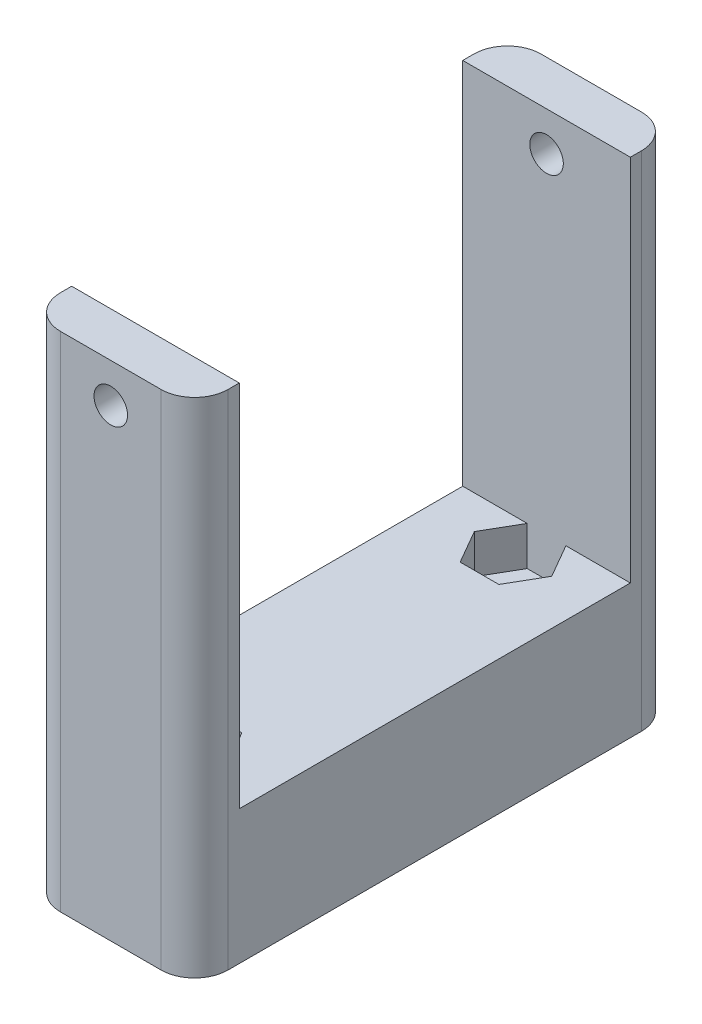
ISO-10303-21;
HEADER;
FILE_DESCRIPTION(('STEP AP214'),'2;1');
FILE_NAME('part.step','',(''),(''),'','','');
FILE_SCHEMA(('AUTOMOTIVE_DESIGN { 1 0 10303 214 1 1 1 1 }'));
ENDSEC;
DATA;
#1=APPLICATION_CONTEXT('core data for automotive mechanical design processes');
#2=APPLICATION_PROTOCOL_DEFINITION('international standard','automotive_design',2000,#1);
#3=PRODUCT_CONTEXT('',#1,'mechanical');
#4=PRODUCT('Part','Part','',(#3));
#5=PRODUCT_RELATED_PRODUCT_CATEGORY('part','',(#4));
#6=PRODUCT_DEFINITION_FORMATION('','',#4);
#7=PRODUCT_DEFINITION_CONTEXT('part definition',#1,'design');
#8=PRODUCT_DEFINITION('design','',#6,#7);
#9=PRODUCT_DEFINITION_SHAPE('','',#8);
#10=(LENGTH_UNIT() NAMED_UNIT(*) SI_UNIT(.MILLI.,.METRE.));
#11=(NAMED_UNIT(*) PLANE_ANGLE_UNIT() SI_UNIT($,.RADIAN.));
#12=(NAMED_UNIT(*) SI_UNIT($,.STERADIAN.) SOLID_ANGLE_UNIT());
#13=UNCERTAINTY_MEASURE_WITH_UNIT(LENGTH_MEASURE(1.E-05),#10,'distance_accuracy_value','');
#14=(GEOMETRIC_REPRESENTATION_CONTEXT(3) GLOBAL_UNCERTAINTY_ASSIGNED_CONTEXT((#13)) GLOBAL_UNIT_ASSIGNED_CONTEXT((#10,
#11,#12)) REPRESENTATION_CONTEXT('',''));
#15=CARTESIAN_POINT('',(0.,0.,0.));
#16=DIRECTION('',(0.,0.,1.));
#17=DIRECTION('',(1.,0.,0.));
#18=AXIS2_PLACEMENT_3D('',#15,#16,#17);
#19=CARTESIAN_POINT('',(0.,13.,-14.5));
#20=DIRECTION('',(0.,-1.,0.));
#21=DIRECTION('',(0.,0.,-1.));
#22=AXIS2_PLACEMENT_3D('',#19,#20,#21);
#23=CYLINDRICAL_SURFACE('',#22,1.5);
#24=CARTESIAN_POINT('',(0.,0.,-14.5));
#25=DIRECTION('',(0.,-1.,0.));
#26=DIRECTION('',(0.,0.,-1.));
#27=AXIS2_PLACEMENT_3D('',#24,#25,#26);
#28=CIRCLE('',#27,1.5);
#29=CARTESIAN_POINT('',(0.,0.,-16.));
#30=VERTEX_POINT('',#29);
#31=EDGE_CURVE('E346',#30,#30,#28,.T.);
#32=CARTESIAN_POINT('',(0.,8.5,-14.5));
#33=DIRECTION('',(0.,1.,0.));
#34=DIRECTION('',(0.,0.,1.));
#35=AXIS2_PLACEMENT_3D('',#32,#33,#34);
#36=CIRCLE('',#35,1.5);
#37=CARTESIAN_POINT('',(0.,8.5,-16.));
#38=VERTEX_POINT('',#37);
#39=EDGE_CURVE('E350',#38,#38,#36,.F.);
#40=CARTESIAN_POINT('',(0.,0.,-16.));
#41=CARTESIAN_POINT('',(0.,0.0885416666666667,-16.));
#42=CARTESIAN_POINT('',(0.,0.177083333333334,-16.));
#43=CARTESIAN_POINT('',(0.,0.354166666666667,-16.));
#44=CARTESIAN_POINT('',(0.,0.442708333333334,-16.));
#45=CARTESIAN_POINT('',(0.,0.619791666666667,-16.));
#46=CARTESIAN_POINT('',(0.,0.708333333333334,-16.));
#47=CARTESIAN_POINT('',(0.,0.885416666666667,-16.));
#48=CARTESIAN_POINT('',(0.,0.973958333333334,-16.));
#49=CARTESIAN_POINT('',(0.,1.15104166666667,-16.));
#50=CARTESIAN_POINT('',(0.,1.23958333333333,-16.));
#51=CARTESIAN_POINT('',(0.,1.41666666666667,-16.));
#52=CARTESIAN_POINT('',(0.,1.50520833333333,-16.));
#53=CARTESIAN_POINT('',(0.,1.68229166666667,-16.));
#54=CARTESIAN_POINT('',(0.,1.77083333333333,-16.));
#55=CARTESIAN_POINT('',(0.,1.94791666666667,-16.));
#56=CARTESIAN_POINT('',(0.,2.03645833333333,-16.));
#57=CARTESIAN_POINT('',(0.,2.21354166666667,-16.));
#58=CARTESIAN_POINT('',(0.,2.30208333333333,-16.));
#59=CARTESIAN_POINT('',(0.,2.47916666666667,-16.));
#60=CARTESIAN_POINT('',(0.,2.56770833333333,-16.));
#61=CARTESIAN_POINT('',(0.,2.74479166666667,-16.));
#62=CARTESIAN_POINT('',(0.,2.83333333333333,-16.));
#63=CARTESIAN_POINT('',(0.,3.01041666666667,-16.));
#64=CARTESIAN_POINT('',(0.,3.09895833333333,-16.));
#65=CARTESIAN_POINT('',(0.,3.27604166666667,-16.));
#66=CARTESIAN_POINT('',(0.,3.36458333333333,-16.));
#67=CARTESIAN_POINT('',(0.,3.54166666666667,-16.));
#68=CARTESIAN_POINT('',(0.,3.63020833333333,-16.));
#69=CARTESIAN_POINT('',(0.,3.80729166666667,-16.));
#70=CARTESIAN_POINT('',(0.,3.89583333333333,-16.));
#71=CARTESIAN_POINT('',(0.,4.07291666666667,-16.));
#72=CARTESIAN_POINT('',(0.,4.16145833333333,-16.));
#73=CARTESIAN_POINT('',(0.,4.33854166666667,-16.));
#74=CARTESIAN_POINT('',(0.,4.42708333333333,-16.));
#75=CARTESIAN_POINT('',(0.,4.60416666666667,-16.));
#76=CARTESIAN_POINT('',(0.,4.69270833333333,-16.));
#77=CARTESIAN_POINT('',(0.,4.86979166666667,-16.));
#78=CARTESIAN_POINT('',(0.,4.95833333333333,-16.));
#79=CARTESIAN_POINT('',(0.,5.13541666666667,-16.));
#80=CARTESIAN_POINT('',(0.,5.22395833333333,-16.));
#81=CARTESIAN_POINT('',(0.,5.40104166666667,-16.));
#82=CARTESIAN_POINT('',(0.,5.48958333333333,-16.));
#83=CARTESIAN_POINT('',(0.,5.66666666666667,-16.));
#84=CARTESIAN_POINT('',(0.,5.75520833333333,-16.));
#85=CARTESIAN_POINT('',(0.,5.93229166666667,-16.));
#86=CARTESIAN_POINT('',(0.,6.02083333333333,-16.));
#87=CARTESIAN_POINT('',(0.,6.19791666666667,-16.));
#88=CARTESIAN_POINT('',(0.,6.28645833333333,-16.));
#89=CARTESIAN_POINT('',(0.,6.46354166666667,-16.));
#90=CARTESIAN_POINT('',(0.,6.55208333333333,-16.));
#91=CARTESIAN_POINT('',(0.,6.72916666666667,-16.));
#92=CARTESIAN_POINT('',(0.,6.81770833333333,-16.));
#93=CARTESIAN_POINT('',(0.,6.99479166666667,-16.));
#94=CARTESIAN_POINT('',(0.,7.08333333333333,-16.));
#95=CARTESIAN_POINT('',(0.,7.26041666666667,-16.));
#96=CARTESIAN_POINT('',(0.,7.34895833333333,-16.));
#97=CARTESIAN_POINT('',(0.,7.52604166666667,-16.));
#98=CARTESIAN_POINT('',(0.,7.61458333333333,-16.));
#99=CARTESIAN_POINT('',(0.,7.79166666666667,-16.));
#100=CARTESIAN_POINT('',(0.,7.88020833333333,-16.));
#101=CARTESIAN_POINT('',(0.,8.05729166666667,-16.));
#102=CARTESIAN_POINT('',(0.,8.14583333333333,-16.));
#103=CARTESIAN_POINT('',(0.,8.32291666666667,-16.));
#104=CARTESIAN_POINT('',(0.,8.41145833333333,-16.));
#105=CARTESIAN_POINT('',(0.,8.5,-16.));
#106=B_SPLINE_CURVE_WITH_KNOTS('',3,(#40,#41,#42,#43,#44,#45,#46,#47,#48,#49,#50,#51,#52,#53,
#54,#55,#56,#57,#58,#59,#60,#61,#62,#63,#64,#65,#66,#67,#68,#69,#70,#71,#72,#73,#74,#75,#76,#77,
#78,#79,#80,#81,#82,#83,#84,#85,#86,#87,#88,#89,#90,#91,#92,#93,#94,#95,#96,#97,#98,#99,#100,
#101,#102,#103,#104,#105),.UNSPECIFIED.,.F.,.F.,(4,2,2,2,2,2,2,2,2,2,2,2,2,2,2,2,2,2,2,2,2,2,2,
2,2,2,2,2,2,2,2,2,4),(0.,0.265625,0.53125,0.796875000000001,1.0625,1.328125,1.59375,1.859375,
2.125,2.390625,2.65625,2.921875,3.1875,3.453125,3.71875,3.984375,4.25,4.515625,4.78125,5.046875,
5.3125,5.578125,5.84375,6.109375,6.375,6.640625,6.90625,7.171875,7.4375,7.703125,7.96875,
8.234375,8.5),.UNSPECIFIED.);
#107=EDGE_CURVE('BSEAM39',#30,#38,#106,.T.);
#108=ORIENTED_EDGE('',*,*,#31,.T.);
#109=ORIENTED_EDGE('',*,*,#39,.F.);
#110=ORIENTED_EDGE('',*,*,#107,.T.);
#111=ORIENTED_EDGE('',*,*,#107,.F.);
#112=EDGE_LOOP('',(#108,#110,#109,#111));
#113=FACE_BOUND('',#112,.T.);
#114=ADVANCED_FACE('F39',(#113),#23,.F.);
#115=CARTESIAN_POINT('',(0.,13.,14.5));
#116=DIRECTION('',(0.,-1.,0.));
#117=DIRECTION('',(0.,0.,-1.));
#118=AXIS2_PLACEMENT_3D('',#115,#116,#117);
#119=CYLINDRICAL_SURFACE('',#118,1.5);
#120=CARTESIAN_POINT('',(0.,0.,14.5));
#121=DIRECTION('',(0.,-1.,0.));
#122=DIRECTION('',(0.,0.,-1.));
#123=AXIS2_PLACEMENT_3D('',#120,#121,#122);
#124=CIRCLE('',#123,1.5);
#125=CARTESIAN_POINT('',(0.,0.,13.));
#126=VERTEX_POINT('',#125);
#127=EDGE_CURVE('E341',#126,#126,#124,.T.);
#128=CARTESIAN_POINT('',(0.,8.5,14.5));
#129=DIRECTION('',(0.,1.,0.));
#130=DIRECTION('',(0.,0.,1.));
#131=AXIS2_PLACEMENT_3D('',#128,#129,#130);
#132=CIRCLE('',#131,1.5);
#133=CARTESIAN_POINT('',(0.,8.5,13.));
#134=VERTEX_POINT('',#133);
#135=EDGE_CURVE('E268',#134,#134,#132,.F.);
#136=CARTESIAN_POINT('',(0.,0.,13.));
#137=CARTESIAN_POINT('',(0.,0.0885416666666667,13.));
#138=CARTESIAN_POINT('',(0.,0.177083333333334,13.));
#139=CARTESIAN_POINT('',(0.,0.354166666666667,13.));
#140=CARTESIAN_POINT('',(0.,0.442708333333334,13.));
#141=CARTESIAN_POINT('',(0.,0.619791666666667,13.));
#142=CARTESIAN_POINT('',(0.,0.708333333333334,13.));
#143=CARTESIAN_POINT('',(0.,0.885416666666667,13.));
#144=CARTESIAN_POINT('',(0.,0.973958333333334,13.));
#145=CARTESIAN_POINT('',(0.,1.15104166666667,13.));
#146=CARTESIAN_POINT('',(0.,1.23958333333333,13.));
#147=CARTESIAN_POINT('',(0.,1.41666666666667,13.));
#148=CARTESIAN_POINT('',(0.,1.50520833333333,13.));
#149=CARTESIAN_POINT('',(0.,1.68229166666667,13.));
#150=CARTESIAN_POINT('',(0.,1.77083333333333,13.));
#151=CARTESIAN_POINT('',(0.,1.94791666666667,13.));
#152=CARTESIAN_POINT('',(0.,2.03645833333333,13.));
#153=CARTESIAN_POINT('',(0.,2.21354166666667,13.));
#154=CARTESIAN_POINT('',(0.,2.30208333333333,13.));
#155=CARTESIAN_POINT('',(0.,2.47916666666667,13.));
#156=CARTESIAN_POINT('',(0.,2.56770833333333,13.));
#157=CARTESIAN_POINT('',(0.,2.74479166666667,13.));
#158=CARTESIAN_POINT('',(0.,2.83333333333333,13.));
#159=CARTESIAN_POINT('',(0.,3.01041666666667,13.));
#160=CARTESIAN_POINT('',(0.,3.09895833333333,13.));
#161=CARTESIAN_POINT('',(0.,3.27604166666667,13.));
#162=CARTESIAN_POINT('',(0.,3.36458333333333,13.));
#163=CARTESIAN_POINT('',(0.,3.54166666666667,13.));
#164=CARTESIAN_POINT('',(0.,3.63020833333333,13.));
#165=CARTESIAN_POINT('',(0.,3.80729166666667,13.));
#166=CARTESIAN_POINT('',(0.,3.89583333333333,13.));
#167=CARTESIAN_POINT('',(0.,4.07291666666667,13.));
#168=CARTESIAN_POINT('',(0.,4.16145833333333,13.));
#169=CARTESIAN_POINT('',(0.,4.33854166666667,13.));
#170=CARTESIAN_POINT('',(0.,4.42708333333333,13.));
#171=CARTESIAN_POINT('',(0.,4.60416666666667,13.));
#172=CARTESIAN_POINT('',(0.,4.69270833333333,13.));
#173=CARTESIAN_POINT('',(0.,4.86979166666667,13.));
#174=CARTESIAN_POINT('',(0.,4.95833333333333,13.));
#175=CARTESIAN_POINT('',(0.,5.13541666666667,13.));
#176=CARTESIAN_POINT('',(0.,5.22395833333333,13.));
#177=CARTESIAN_POINT('',(0.,5.40104166666667,13.));
#178=CARTESIAN_POINT('',(0.,5.48958333333333,13.));
#179=CARTESIAN_POINT('',(0.,5.66666666666667,13.));
#180=CARTESIAN_POINT('',(0.,5.75520833333333,13.));
#181=CARTESIAN_POINT('',(0.,5.93229166666667,13.));
#182=CARTESIAN_POINT('',(0.,6.02083333333333,13.));
#183=CARTESIAN_POINT('',(0.,6.19791666666667,13.));
#184=CARTESIAN_POINT('',(0.,6.28645833333333,13.));
#185=CARTESIAN_POINT('',(0.,6.46354166666667,13.));
#186=CARTESIAN_POINT('',(0.,6.55208333333333,13.));
#187=CARTESIAN_POINT('',(0.,6.72916666666667,13.));
#188=CARTESIAN_POINT('',(0.,6.81770833333333,13.));
#189=CARTESIAN_POINT('',(0.,6.99479166666667,13.));
#190=CARTESIAN_POINT('',(0.,7.08333333333333,13.));
#191=CARTESIAN_POINT('',(0.,7.26041666666667,13.));
#192=CARTESIAN_POINT('',(0.,7.34895833333333,13.));
#193=CARTESIAN_POINT('',(0.,7.52604166666667,13.));
#194=CARTESIAN_POINT('',(0.,7.61458333333333,13.));
#195=CARTESIAN_POINT('',(0.,7.79166666666667,13.));
#196=CARTESIAN_POINT('',(0.,7.88020833333333,13.));
#197=CARTESIAN_POINT('',(0.,8.05729166666667,13.));
#198=CARTESIAN_POINT('',(0.,8.14583333333333,13.));
#199=CARTESIAN_POINT('',(0.,8.32291666666667,13.));
#200=CARTESIAN_POINT('',(0.,8.41145833333333,13.));
#201=CARTESIAN_POINT('',(0.,8.5,13.));
#202=B_SPLINE_CURVE_WITH_KNOTS('',3,(#136,#137,#138,#139,#140,#141,#142,#143,#144,#145,#146,
#147,#148,#149,#150,#151,#152,#153,#154,#155,#156,#157,#158,#159,#160,#161,#162,#163,#164,#165,
#166,#167,#168,#169,#170,#171,#172,#173,#174,#175,#176,#177,#178,#179,#180,#181,#182,#183,#184,
#185,#186,#187,#188,#189,#190,#191,#192,#193,#194,#195,#196,#197,#198,#199,#200,#201),
.UNSPECIFIED.,.F.,.F.,(4,2,2,2,2,2,2,2,2,2,2,2,2,2,2,2,2,2,2,2,2,2,2,2,2,2,2,2,2,2,2,2,4),(0.,
0.265625,0.53125,0.796875000000001,1.0625,1.328125,1.59375,1.859375,2.125,2.390625,2.65625,
2.921875,3.1875,3.453125,3.71875,3.984375,4.25,4.515625,4.78125,5.046875,5.3125,5.578125,
5.84375,6.109375,6.375,6.640625,6.90625,7.171875,7.4375,7.703125,7.96875,8.234375,8.5),.UNSPECIFIED.);
#203=EDGE_CURVE('BSEAM568',#126,#134,#202,.T.);
#204=ORIENTED_EDGE('',*,*,#127,.T.);
#205=ORIENTED_EDGE('',*,*,#135,.F.);
#206=ORIENTED_EDGE('',*,*,#203,.T.);
#207=ORIENTED_EDGE('',*,*,#203,.F.);
#208=EDGE_LOOP('',(#204,#206,#205,#207));
#209=FACE_BOUND('',#208,.T.);
#210=ADVANCED_FACE('F568',(#209),#119,.F.);
#211=CARTESIAN_POINT('',(0.,12.,0.));
#212=DIRECTION('',(0.,1.,0.));
#213=DIRECTION('',(0.,0.,1.));
#214=AXIS2_PLACEMENT_3D('',#211,#212,#213);
#215=PLANE('',#214);
#216=DIRECTION('',(-0.5,0.,0.866025403784439));
#217=VECTOR('',#216,1.);
#218=CARTESIAN_POINT('',(-1.73205080756888,12.,-17.5));
#219=LINE('',#218,#217);
#220=CARTESIAN_POINT('',(-1.73205080756888,12.,-17.5));
#221=VERTEX_POINT('',#220);
#222=CARTESIAN_POINT('',(-3.46410161513776,12.,-14.5));
#223=VERTEX_POINT('',#222);
#224=EDGE_CURVE('E258',#221,#223,#219,.T.);
#225=ORIENTED_EDGE('',*,*,#224,.F.);
#226=DIRECTION('',(1.,0.,0.));
#227=VECTOR('',#226,1.);
#228=CARTESIAN_POINT('',(-7.5,12.,-17.5));
#229=LINE('',#228,#227);
#230=CARTESIAN_POINT('',(-7.5,12.,-17.5));
#231=VERTEX_POINT('',#230);
#232=EDGE_CURVE('E382',#231,#221,#229,.T.);
#233=ORIENTED_EDGE('',*,*,#232,.F.);
#234=DIRECTION('',(0.,0.,1.));
#235=VECTOR('',#234,1.);
#236=CARTESIAN_POINT('',(-7.5,12.,-21.5));
#237=LINE('',#236,#235);
#238=CARTESIAN_POINT('',(-7.5,12.,17.5));
#239=VERTEX_POINT('',#238);
#240=EDGE_CURVE('E403',#231,#239,#237,.T.);
#241=ORIENTED_EDGE('',*,*,#240,.T.);
#242=DIRECTION('',(-1.,0.,0.));
#243=VECTOR('',#242,1.);
#244=CARTESIAN_POINT('',(7.5,12.,17.5));
#245=LINE('',#244,#243);
#246=CARTESIAN_POINT('',(-1.73205080756888,12.,17.5));
#247=VERTEX_POINT('',#246);
#248=EDGE_CURVE('E345',#247,#239,#245,.T.);
#249=ORIENTED_EDGE('',*,*,#248,.F.);
#250=DIRECTION('',(0.5,0.,0.866025403784438));
#251=VECTOR('',#250,1.);
#252=CARTESIAN_POINT('',(-3.46410161513776,12.,14.5));
#253=LINE('',#252,#251);
#254=CARTESIAN_POINT('',(-3.46410161513776,12.,14.5));
#255=VERTEX_POINT('',#254);
#256=EDGE_CURVE('E285',#255,#247,#253,.T.);
#257=ORIENTED_EDGE('',*,*,#256,.F.);
#258=DIRECTION('',(-0.5,0.,0.866025403784438));
#259=VECTOR('',#258,1.);
#260=CARTESIAN_POINT('',(-1.73205080756888,12.,11.5));
#261=LINE('',#260,#259);
#262=CARTESIAN_POINT('',(-1.73205080756888,12.,11.5));
#263=VERTEX_POINT('',#262);
#264=EDGE_CURVE('E318',#263,#255,#261,.T.);
#265=ORIENTED_EDGE('',*,*,#264,.F.);
#266=DIRECTION('',(-1.,0.,0.));
#267=VECTOR('',#266,1.);
#268=CARTESIAN_POINT('',(1.73205080756887,12.,11.5));
#269=LINE('',#268,#267);
#270=CARTESIAN_POINT('',(1.73205080756887,12.,11.5));
#271=VERTEX_POINT('',#270);
#272=EDGE_CURVE('E314',#271,#263,#269,.T.);
#273=ORIENTED_EDGE('',*,*,#272,.F.);
#274=DIRECTION('',(-0.5,0.,-0.866025403784438));
#275=VECTOR('',#274,1.);
#276=CARTESIAN_POINT('',(3.46410161513775,12.,14.5));
#277=LINE('',#276,#275);
#278=CARTESIAN_POINT('',(3.46410161513775,12.,14.5));
#279=VERTEX_POINT('',#278);
#280=EDGE_CURVE('E310',#279,#271,#277,.T.);
#281=ORIENTED_EDGE('',*,*,#280,.F.);
#282=DIRECTION('',(0.5,0.,-0.866025403784439));
#283=VECTOR('',#282,1.);
#284=CARTESIAN_POINT('',(1.73205080756887,12.,17.5));
#285=LINE('',#284,#283);
#286=CARTESIAN_POINT('',(1.73205080756887,12.,17.5));
#287=VERTEX_POINT('',#286);
#288=EDGE_CURVE('E306',#287,#279,#285,.T.);
#289=ORIENTED_EDGE('',*,*,#288,.F.);
#290=CARTESIAN_POINT('',(7.5,12.,17.5));
#291=VERTEX_POINT('',#290);
#292=EDGE_CURVE('E355',#291,#287,#245,.T.);
#293=ORIENTED_EDGE('',*,*,#292,.F.);
#294=DIRECTION('',(0.,0.,-1.));
#295=VECTOR('',#294,1.);
#296=CARTESIAN_POINT('',(7.5,12.,-21.5));
#297=LINE('',#296,#295);
#298=CARTESIAN_POINT('',(7.5,12.,-17.5));
#299=VERTEX_POINT('',#298);
#300=EDGE_CURVE('E407',#291,#299,#297,.T.);
#301=ORIENTED_EDGE('',*,*,#300,.T.);
#302=CARTESIAN_POINT('',(1.73205080756887,12.,-17.5));
#303=VERTEX_POINT('',#302);
#304=EDGE_CURVE('E377',#303,#299,#229,.T.);
#305=ORIENTED_EDGE('',*,*,#304,.F.);
#306=DIRECTION('',(-0.5,0.,-0.866025403784439));
#307=VECTOR('',#306,1.);
#308=CARTESIAN_POINT('',(3.46410161513775,12.,-14.5));
#309=LINE('',#308,#307);
#310=CARTESIAN_POINT('',(3.46410161513775,12.,-14.5));
#311=VERTEX_POINT('',#310);
#312=EDGE_CURVE('E254',#311,#303,#309,.T.);
#313=ORIENTED_EDGE('',*,*,#312,.F.);
#314=DIRECTION('',(0.5,0.,-0.866025403784438));
#315=VECTOR('',#314,1.);
#316=CARTESIAN_POINT('',(1.73205080756887,12.,-11.5));
#317=LINE('',#316,#315);
#318=CARTESIAN_POINT('',(1.73205080756887,12.,-11.5));
#319=VERTEX_POINT('',#318);
#320=EDGE_CURVE('E209',#319,#311,#317,.T.);
#321=ORIENTED_EDGE('',*,*,#320,.F.);
#322=DIRECTION('',(1.,0.,0.));
#323=VECTOR('',#322,1.);
#324=CARTESIAN_POINT('',(-1.73205080756889,12.,-11.5));
#325=LINE('',#324,#323);
#326=CARTESIAN_POINT('',(-1.73205080756889,12.,-11.5));
#327=VERTEX_POINT('',#326);
#328=EDGE_CURVE('E231',#327,#319,#325,.T.);
#329=ORIENTED_EDGE('',*,*,#328,.F.);
#330=DIRECTION('',(0.5,0.,0.866025403784439));
#331=VECTOR('',#330,1.);
#332=CARTESIAN_POINT('',(-3.46410161513776,12.,-14.5));
#333=LINE('',#332,#331);
#334=EDGE_CURVE('E235',#223,#327,#333,.T.);
#335=ORIENTED_EDGE('',*,*,#334,.F.);
#336=EDGE_LOOP('',(#225,#233,#241,#249,#257,#265,#273,#281,#289,#293,#301,#305,#313,#321,#329,#335));
#337=FACE_BOUND('',#336,.T.);
#338=ADVANCED_FACE('F534',(#337),#215,.T.);
#339=CARTESIAN_POINT('',(-7.5,12.,-21.5));
#340=DIRECTION('',(1.,0.,0.));
#341=DIRECTION('',(0.,0.,-1.));
#342=AXIS2_PLACEMENT_3D('',#339,#340,#341);
#343=PLANE('',#342);
#344=DIRECTION('',(0.,0.,1.));
#345=VECTOR('',#344,1.);
#346=CARTESIAN_POINT('',(-7.5,0.,-21.5));
#347=LINE('',#346,#345);
#348=CARTESIAN_POINT('',(-7.5,0.,-18.5));
#349=VERTEX_POINT('',#348);
#350=CARTESIAN_POINT('',(-7.5,0.,18.5));
#351=VERTEX_POINT('',#350);
#352=EDGE_CURVE('E402',#349,#351,#347,.T.);
#353=ORIENTED_EDGE('',*,*,#352,.T.);
#354=DIRECTION('',(0.,-1.,0.));
#355=VECTOR('',#354,1.);
#356=CARTESIAN_POINT('',(-7.5,12.,18.5));
#357=LINE('',#356,#355);
#358=CARTESIAN_POINT('',(-7.5,45.,18.5));
#359=VERTEX_POINT('',#358);
#360=EDGE_CURVE('E467',#351,#359,#357,.F.);
#361=ORIENTED_EDGE('',*,*,#360,.T.);
#362=DIRECTION('',(0.,0.,1.));
#363=VECTOR('',#362,1.);
#364=CARTESIAN_POINT('',(-7.5,45.,21.5));
#365=LINE('',#364,#363);
#366=CARTESIAN_POINT('',(-7.5,45.,17.5));
#367=VERTEX_POINT('',#366);
#368=EDGE_CURVE('E358',#367,#359,#365,.T.);
#369=ORIENTED_EDGE('',*,*,#368,.F.);
#370=DIRECTION('',(0.,-1.,0.));
#371=VECTOR('',#370,1.);
#372=CARTESIAN_POINT('',(-7.5,45.,17.5));
#373=LINE('',#372,#371);
#374=EDGE_CURVE('E366',#367,#239,#373,.T.);
#375=ORIENTED_EDGE('',*,*,#374,.T.);
#376=ORIENTED_EDGE('',*,*,#240,.F.);
#377=DIRECTION('',(0.,-1.,0.));
#378=VECTOR('',#377,1.);
#379=CARTESIAN_POINT('',(-7.5,45.,-17.5));
#380=LINE('',#379,#378);
#381=CARTESIAN_POINT('',(-7.5,45.,-17.5));
#382=VERTEX_POINT('',#381);
#383=EDGE_CURVE('E398',#382,#231,#380,.T.);
#384=ORIENTED_EDGE('',*,*,#383,.F.);
#385=DIRECTION('',(0.,0.,1.));
#386=VECTOR('',#385,1.);
#387=CARTESIAN_POINT('',(-7.5,45.,-21.5));
#388=LINE('',#387,#386);
#389=CARTESIAN_POINT('',(-7.5,45.,-18.5));
#390=VERTEX_POINT('',#389);
#391=EDGE_CURVE('E378',#390,#382,#388,.T.);
#392=ORIENTED_EDGE('',*,*,#391,.F.);
#393=DIRECTION('',(0.,-1.,0.));
#394=VECTOR('',#393,1.);
#395=CARTESIAN_POINT('',(-7.5,12.,-18.5));
#396=LINE('',#395,#394);
#397=EDGE_CURVE('E463',#390,#349,#396,.T.);
#398=ORIENTED_EDGE('',*,*,#397,.T.);
#399=EDGE_LOOP('',(#353,#361,#369,#375,#376,#384,#392,#398));
#400=FACE_BOUND('',#399,.T.);
#401=ADVANCED_FACE('F485',(#400),#343,.F.);
#402=CARTESIAN_POINT('',(-7.5,12.,21.5));
#403=DIRECTION('',(0.,0.,-1.));
#404=DIRECTION('',(-1.,0.,0.));
#405=AXIS2_PLACEMENT_3D('',#402,#403,#404);
#406=PLANE('',#405);
#407=CARTESIAN_POINT('',(0.,41.5,21.5));
#408=DIRECTION('',(0.,0.,-1.));
#409=DIRECTION('',(-1.,0.,0.));
#410=AXIS2_PLACEMENT_3D('',#407,#408,#409);
#411=CIRCLE('',#410,1.5);
#412=CARTESIAN_POINT('',(-1.5,41.5,21.5));
#413=VERTEX_POINT('',#412);
#414=EDGE_CURVE('E845',#413,#413,#411,.T.);
#415=ORIENTED_EDGE('',*,*,#414,.T.);
#416=EDGE_LOOP('',(#415));
#417=FACE_BOUND('',#416,.T.);
#418=DIRECTION('',(1.,0.,0.));
#419=VECTOR('',#418,1.);
#420=CARTESIAN_POINT('',(-7.5,0.,21.5));
#421=LINE('',#420,#419);
#422=CARTESIAN_POINT('',(-4.5,0.,21.5));
#423=VERTEX_POINT('',#422);
#424=CARTESIAN_POINT('',(4.5,0.,21.5));
#425=VERTEX_POINT('',#424);
#426=EDGE_CURVE('E416',#423,#425,#421,.T.);
#427=ORIENTED_EDGE('',*,*,#426,.T.);
#428=DIRECTION('',(0.,-1.,0.));
#429=VECTOR('',#428,1.);
#430=CARTESIAN_POINT('',(4.5,12.,21.5));
#431=LINE('',#430,#429);
#432=CARTESIAN_POINT('',(4.5,45.,21.5));
#433=VERTEX_POINT('',#432);
#434=EDGE_CURVE('E454',#425,#433,#431,.F.);
#435=ORIENTED_EDGE('',*,*,#434,.T.);
#436=DIRECTION('',(1.,0.,0.));
#437=VECTOR('',#436,1.);
#438=CARTESIAN_POINT('',(7.5,45.,21.5));
#439=LINE('',#438,#437);
#440=CARTESIAN_POINT('',(-4.5,45.,21.5));
#441=VERTEX_POINT('',#440);
#442=EDGE_CURVE('E362',#441,#433,#439,.T.);
#443=ORIENTED_EDGE('',*,*,#442,.F.);
#444=DIRECTION('',(0.,-1.,0.));
#445=VECTOR('',#444,1.);
#446=CARTESIAN_POINT('',(-4.5,12.,21.5));
#447=LINE('',#446,#445);
#448=EDGE_CURVE('E450',#441,#423,#447,.T.);
#449=ORIENTED_EDGE('',*,*,#448,.T.);
#450=EDGE_LOOP('',(#427,#435,#443,#449));
#451=FACE_BOUND('',#450,.T.);
#452=ADVANCED_FACE('F509',(#417,#451),#406,.F.);
#453=CARTESIAN_POINT('',(7.5,12.,-21.5));
#454=DIRECTION('',(-1.,0.,0.));
#455=DIRECTION('',(0.,0.,1.));
#456=AXIS2_PLACEMENT_3D('',#453,#454,#455);
#457=PLANE('',#456);
#458=DIRECTION('',(0.,0.,-1.));
#459=VECTOR('',#458,1.);
#460=CARTESIAN_POINT('',(7.5,45.,21.5));
#461=LINE('',#460,#459);
#462=CARTESIAN_POINT('',(7.5,45.,18.5));
#463=VERTEX_POINT('',#462);
#464=CARTESIAN_POINT('',(7.5,45.,17.5));
#465=VERTEX_POINT('',#464);
#466=EDGE_CURVE('E351',#463,#465,#461,.T.);
#467=ORIENTED_EDGE('',*,*,#466,.F.);
#468=DIRECTION('',(0.,-1.,0.));
#469=VECTOR('',#468,1.);
#470=CARTESIAN_POINT('',(7.5,12.,18.5));
#471=LINE('',#470,#469);
#472=CARTESIAN_POINT('',(7.5,0.,18.5));
#473=VERTEX_POINT('',#472);
#474=EDGE_CURVE('E434',#463,#473,#471,.T.);
#475=ORIENTED_EDGE('',*,*,#474,.T.);
#476=DIRECTION('',(0.,0.,-1.));
#477=VECTOR('',#476,1.);
#478=CARTESIAN_POINT('',(7.5,0.,-21.5));
#479=LINE('',#478,#477);
#480=CARTESIAN_POINT('',(7.5,0.,-18.5));
#481=VERTEX_POINT('',#480);
#482=EDGE_CURVE('E420',#473,#481,#479,.T.);
#483=ORIENTED_EDGE('',*,*,#482,.T.);
#484=DIRECTION('',(0.,-1.,0.));
#485=VECTOR('',#484,1.);
#486=CARTESIAN_POINT('',(7.5,12.,-18.5));
#487=LINE('',#486,#485);
#488=CARTESIAN_POINT('',(7.5,45.,-18.5));
#489=VERTEX_POINT('',#488);
#490=EDGE_CURVE('E412',#481,#489,#487,.F.);
#491=ORIENTED_EDGE('',*,*,#490,.T.);
#492=DIRECTION('',(0.,0.,-1.));
#493=VECTOR('',#492,1.);
#494=CARTESIAN_POINT('',(7.5,45.,-21.5));
#495=LINE('',#494,#493);
#496=CARTESIAN_POINT('',(7.5,45.,-17.5));
#497=VERTEX_POINT('',#496);
#498=EDGE_CURVE('E385',#497,#489,#495,.T.);
#499=ORIENTED_EDGE('',*,*,#498,.F.);
#500=DIRECTION('',(0.,-1.,0.));
#501=VECTOR('',#500,1.);
#502=CARTESIAN_POINT('',(7.5,45.,-17.5));
#503=LINE('',#502,#501);
#504=EDGE_CURVE('E391',#497,#299,#503,.T.);
#505=ORIENTED_EDGE('',*,*,#504,.T.);
#506=ORIENTED_EDGE('',*,*,#300,.F.);
#507=DIRECTION('',(0.,-1.,0.));
#508=VECTOR('',#507,1.);
#509=CARTESIAN_POINT('',(7.5,45.,17.5));
#510=LINE('',#509,#508);
#511=EDGE_CURVE('E373',#465,#291,#510,.T.);
#512=ORIENTED_EDGE('',*,*,#511,.F.);
#513=EDGE_LOOP('',(#467,#475,#483,#491,#499,#505,#506,#512));
#514=FACE_BOUND('',#513,.T.);
#515=ADVANCED_FACE('F499',(#514),#457,.F.);
#516=CARTESIAN_POINT('',(-7.5,12.,-21.5));
#517=DIRECTION('',(0.,0.,1.));
#518=DIRECTION('',(1.,0.,0.));
#519=AXIS2_PLACEMENT_3D('',#516,#517,#518);
#520=PLANE('',#519);
#521=CARTESIAN_POINT('',(0.,41.5,-21.5));
#522=DIRECTION('',(0.,0.,1.));
#523=DIRECTION('',(1.,0.,0.));
#524=AXIS2_PLACEMENT_3D('',#521,#522,#523);
#525=CIRCLE('',#524,1.5);
#526=CARTESIAN_POINT('',(1.5,41.5,-21.5));
#527=VERTEX_POINT('',#526);
#528=EDGE_CURVE('E238',#527,#527,#525,.T.);
#529=ORIENTED_EDGE('',*,*,#528,.T.);
#530=EDGE_LOOP('',(#529));
#531=FACE_BOUND('',#530,.T.);
#532=DIRECTION('',(-1.,0.,0.));
#533=VECTOR('',#532,1.);
#534=CARTESIAN_POINT('',(-7.5,45.,-21.5));
#535=LINE('',#534,#533);
#536=CARTESIAN_POINT('',(4.5,45.,-21.5));
#537=VERTEX_POINT('',#536);
#538=CARTESIAN_POINT('',(-4.5,45.,-21.5));
#539=VERTEX_POINT('',#538);
#540=EDGE_CURVE('E388',#537,#539,#535,.T.);
#541=ORIENTED_EDGE('',*,*,#540,.F.);
#542=DIRECTION('',(0.,-1.,0.));
#543=VECTOR('',#542,1.);
#544=CARTESIAN_POINT('',(4.5,12.,-21.5));
#545=LINE('',#544,#543);
#546=CARTESIAN_POINT('',(4.5,0.,-21.5));
#547=VERTEX_POINT('',#546);
#548=EDGE_CURVE('E472',#537,#547,#545,.T.);
#549=ORIENTED_EDGE('',*,*,#548,.T.);
#550=DIRECTION('',(-1.,0.,0.));
#551=VECTOR('',#550,1.);
#552=CARTESIAN_POINT('',(-7.5,0.,-21.5));
#553=LINE('',#552,#551);
#554=CARTESIAN_POINT('',(-4.5,0.,-21.5));
#555=VERTEX_POINT('',#554);
#556=EDGE_CURVE('E408',#547,#555,#553,.T.);
#557=ORIENTED_EDGE('',*,*,#556,.T.);
#558=DIRECTION('',(0.,-1.,0.));
#559=VECTOR('',#558,1.);
#560=CARTESIAN_POINT('',(-4.5,12.,-21.5));
#561=LINE('',#560,#559);
#562=EDGE_CURVE('E56',#555,#539,#561,.F.);
#563=ORIENTED_EDGE('',*,*,#562,.T.);
#564=EDGE_LOOP('',(#541,#549,#557,#563));
#565=FACE_BOUND('',#564,.T.);
#566=ADVANCED_FACE('F492',(#531,#565),#520,.F.);
#567=CARTESIAN_POINT('',(0.,0.,0.));
#568=DIRECTION('',(0.,1.,0.));
#569=DIRECTION('',(0.,0.,1.));
#570=AXIS2_PLACEMENT_3D('',#567,#568,#569);
#571=PLANE('',#570);
#572=ORIENTED_EDGE('',*,*,#127,.F.);
#573=EDGE_LOOP('',(#572));
#574=FACE_BOUND('',#573,.T.);
#575=ORIENTED_EDGE('',*,*,#31,.F.);
#576=EDGE_LOOP('',(#575));
#577=FACE_BOUND('',#576,.T.);
#578=ORIENTED_EDGE('',*,*,#482,.F.);
#579=CARTESIAN_POINT('',(4.5,0.,18.5));
#580=DIRECTION('',(0.,1.,0.));
#581=DIRECTION('',(0.,0.,1.));
#582=AXIS2_PLACEMENT_3D('',#579,#580,#581);
#583=CIRCLE('',#582,3.);
#584=EDGE_CURVE('E447',#473,#425,#583,.F.);
#585=ORIENTED_EDGE('',*,*,#584,.T.);
#586=ORIENTED_EDGE('',*,*,#426,.F.);
#587=CARTESIAN_POINT('',(-4.5,0.,18.5));
#588=DIRECTION('',(0.,1.,0.));
#589=DIRECTION('',(0.,0.,1.));
#590=AXIS2_PLACEMENT_3D('',#587,#588,#589);
#591=CIRCLE('',#590,3.);
#592=EDGE_CURVE('E444',#423,#351,#591,.F.);
#593=ORIENTED_EDGE('',*,*,#592,.T.);
#594=ORIENTED_EDGE('',*,*,#352,.F.);
#595=CARTESIAN_POINT('',(-4.5,0.,-18.5));
#596=DIRECTION('',(0.,1.,0.));
#597=DIRECTION('',(0.,0.,1.));
#598=AXIS2_PLACEMENT_3D('',#595,#596,#597);
#599=CIRCLE('',#598,3.);
#600=EDGE_CURVE('E438',#349,#555,#599,.F.);
#601=ORIENTED_EDGE('',*,*,#600,.T.);
#602=ORIENTED_EDGE('',*,*,#556,.F.);
#603=CARTESIAN_POINT('',(4.5,0.,-18.5));
#604=DIRECTION('',(0.,1.,0.));
#605=DIRECTION('',(0.,0.,1.));
#606=AXIS2_PLACEMENT_3D('',#603,#604,#605);
#607=CIRCLE('',#606,3.);
#608=EDGE_CURVE('E441',#547,#481,#607,.F.);
#609=ORIENTED_EDGE('',*,*,#608,.T.);
#610=EDGE_LOOP('',(#578,#585,#586,#593,#594,#601,#602,#609));
#611=FACE_BOUND('',#610,.T.);
#612=ADVANCED_FACE('F491',(#574,#577,#611),#571,.F.);
#613=CARTESIAN_POINT('',(-7.5,45.,-17.5));
#614=DIRECTION('',(0.,0.,-1.));
#615=DIRECTION('',(-1.,0.,0.));
#616=AXIS2_PLACEMENT_3D('',#613,#614,#615);
#617=PLANE('',#616);
#618=CARTESIAN_POINT('',(0.,41.5,-17.5));
#619=DIRECTION('',(0.,0.,-1.));
#620=DIRECTION('',(-1.,0.,0.));
#621=AXIS2_PLACEMENT_3D('',#618,#619,#620);
#622=CIRCLE('',#621,1.5);
#623=CARTESIAN_POINT('',(-1.5,41.5,-17.5));
#624=VERTEX_POINT('',#623);
#625=EDGE_CURVE('E849',#624,#624,#622,.T.);
#626=ORIENTED_EDGE('',*,*,#625,.T.);
#627=EDGE_LOOP('',(#626));
#628=FACE_BOUND('',#627,.T.);
#629=ORIENTED_EDGE('',*,*,#232,.T.);
#630=DIRECTION('',(0.,1.,0.));
#631=VECTOR('',#630,1.);
#632=CARTESIAN_POINT('',(-1.73205080756888,8.5,-17.5));
#633=LINE('',#632,#631);
#634=CARTESIAN_POINT('',(-1.73205080756888,8.5,-17.5));
#635=VERTEX_POINT('',#634);
#636=EDGE_CURVE('E275',#635,#221,#633,.T.);
#637=ORIENTED_EDGE('',*,*,#636,.F.);
#638=DIRECTION('',(-1.,0.,0.));
#639=VECTOR('',#638,1.);
#640=CARTESIAN_POINT('',(1.73205080756887,8.5,-17.5));
#641=LINE('',#640,#639);
#642=CARTESIAN_POINT('',(1.73205080756887,8.5,-17.5));
#643=VERTEX_POINT('',#642);
#644=EDGE_CURVE('E224',#643,#635,#641,.T.);
#645=ORIENTED_EDGE('',*,*,#644,.F.);
#646=DIRECTION('',(0.,1.,0.));
#647=VECTOR('',#646,1.);
#648=CARTESIAN_POINT('',(1.73205080756887,8.5,-17.5));
#649=LINE('',#648,#647);
#650=EDGE_CURVE('E213',#643,#303,#649,.T.);
#651=ORIENTED_EDGE('',*,*,#650,.T.);
#652=ORIENTED_EDGE('',*,*,#304,.T.);
#653=ORIENTED_EDGE('',*,*,#504,.F.);
#654=DIRECTION('',(1.,0.,0.));
#655=VECTOR('',#654,1.);
#656=CARTESIAN_POINT('',(-7.5,45.,-17.5));
#657=LINE('',#656,#655);
#658=EDGE_CURVE('E381',#382,#497,#657,.T.);
#659=ORIENTED_EDGE('',*,*,#658,.F.);
#660=ORIENTED_EDGE('',*,*,#383,.T.);
#661=EDGE_LOOP('',(#629,#637,#645,#651,#652,#653,#659,#660));
#662=FACE_BOUND('',#661,.T.);
#663=ADVANCED_FACE('F526',(#628,#662),#617,.F.);
#664=CARTESIAN_POINT('',(0.,45.,0.));
#665=DIRECTION('',(0.,1.,0.));
#666=DIRECTION('',(0.,0.,1.));
#667=AXIS2_PLACEMENT_3D('',#664,#665,#666);
#668=PLANE('',#667);
#669=ORIENTED_EDGE('',*,*,#498,.T.);
#670=CARTESIAN_POINT('',(4.5,45.,-18.5));
#671=DIRECTION('',(0.,1.,0.));
#672=DIRECTION('',(0.,0.,1.));
#673=AXIS2_PLACEMENT_3D('',#670,#671,#672);
#674=CIRCLE('',#673,3.);
#675=EDGE_CURVE('E11',#489,#537,#674,.T.);
#676=ORIENTED_EDGE('',*,*,#675,.T.);
#677=ORIENTED_EDGE('',*,*,#540,.T.);
#678=CARTESIAN_POINT('',(-4.5,45.,-18.5));
#679=DIRECTION('',(0.,1.,0.));
#680=DIRECTION('',(0.,0.,1.));
#681=AXIS2_PLACEMENT_3D('',#678,#679,#680);
#682=CIRCLE('',#681,3.);
#683=EDGE_CURVE('E49',#539,#390,#682,.T.);
#684=ORIENTED_EDGE('',*,*,#683,.T.);
#685=ORIENTED_EDGE('',*,*,#391,.T.);
#686=ORIENTED_EDGE('',*,*,#658,.T.);
#687=EDGE_LOOP('',(#669,#676,#677,#684,#685,#686));
#688=FACE_BOUND('',#687,.T.);
#689=ADVANCED_FACE('F479',(#688),#668,.T.);
#690=CARTESIAN_POINT('',(7.5,45.,17.5));
#691=DIRECTION('',(0.,0.,1.));
#692=DIRECTION('',(1.,0.,0.));
#693=AXIS2_PLACEMENT_3D('',#690,#691,#692);
#694=PLANE('',#693);
#695=CARTESIAN_POINT('',(0.,41.5,17.5));
#696=DIRECTION('',(0.,0.,1.));
#697=DIRECTION('',(1.,0.,0.));
#698=AXIS2_PLACEMENT_3D('',#695,#696,#697);
#699=CIRCLE('',#698,1.5);
#700=CARTESIAN_POINT('',(1.5,41.5,17.5));
#701=VERTEX_POINT('',#700);
#702=EDGE_CURVE('E43',#701,#701,#699,.T.);
#703=ORIENTED_EDGE('',*,*,#702,.T.);
#704=EDGE_LOOP('',(#703));
#705=FACE_BOUND('',#704,.T.);
#706=ORIENTED_EDGE('',*,*,#292,.T.);
#707=DIRECTION('',(0.,1.,0.));
#708=VECTOR('',#707,1.);
#709=CARTESIAN_POINT('',(1.73205080756887,8.5,17.5));
#710=LINE('',#709,#708);
#711=CARTESIAN_POINT('',(1.73205080756887,8.5,17.5));
#712=VERTEX_POINT('',#711);
#713=EDGE_CURVE('E255',#712,#287,#710,.T.);
#714=ORIENTED_EDGE('',*,*,#713,.F.);
#715=DIRECTION('',(1.,0.,0.));
#716=VECTOR('',#715,1.);
#717=CARTESIAN_POINT('',(-1.73205080756888,8.5,17.5));
#718=LINE('',#717,#716);
#719=CARTESIAN_POINT('',(-1.73205080756888,8.5,17.5));
#720=VERTEX_POINT('',#719);
#721=EDGE_CURVE('E301',#720,#712,#718,.T.);
#722=ORIENTED_EDGE('',*,*,#721,.F.);
#723=DIRECTION('',(0.,1.,0.));
#724=VECTOR('',#723,1.);
#725=CARTESIAN_POINT('',(-1.73205080756888,8.5,17.5));
#726=LINE('',#725,#724);
#727=EDGE_CURVE('E326',#720,#247,#726,.T.);
#728=ORIENTED_EDGE('',*,*,#727,.T.);
#729=ORIENTED_EDGE('',*,*,#248,.T.);
#730=ORIENTED_EDGE('',*,*,#374,.F.);
#731=DIRECTION('',(-1.,0.,0.));
#732=VECTOR('',#731,1.);
#733=CARTESIAN_POINT('',(7.5,45.,17.5));
#734=LINE('',#733,#732);
#735=EDGE_CURVE('E354',#465,#367,#734,.T.);
#736=ORIENTED_EDGE('',*,*,#735,.F.);
#737=ORIENTED_EDGE('',*,*,#511,.T.);
#738=EDGE_LOOP('',(#706,#714,#722,#728,#729,#730,#736,#737));
#739=FACE_BOUND('',#738,.T.);
#740=ADVANCED_FACE('F522',(#705,#739),#694,.F.);
#741=CARTESIAN_POINT('',(0.,45.,0.));
#742=DIRECTION('',(0.,1.,0.));
#743=DIRECTION('',(0.,0.,1.));
#744=AXIS2_PLACEMENT_3D('',#741,#742,#743);
#745=PLANE('',#744);
#746=ORIENTED_EDGE('',*,*,#442,.T.);
#747=CARTESIAN_POINT('',(4.5,45.,18.5));
#748=DIRECTION('',(0.,1.,0.));
#749=DIRECTION('',(0.,0.,1.));
#750=AXIS2_PLACEMENT_3D('',#747,#748,#749);
#751=CIRCLE('',#750,3.);
#752=EDGE_CURVE('E460',#433,#463,#751,.T.);
#753=ORIENTED_EDGE('',*,*,#752,.T.);
#754=ORIENTED_EDGE('',*,*,#466,.T.);
#755=ORIENTED_EDGE('',*,*,#735,.T.);
#756=ORIENTED_EDGE('',*,*,#368,.T.);
#757=CARTESIAN_POINT('',(-4.5,45.,18.5));
#758=DIRECTION('',(0.,1.,0.));
#759=DIRECTION('',(0.,0.,1.));
#760=AXIS2_PLACEMENT_3D('',#757,#758,#759);
#761=CIRCLE('',#760,3.);
#762=EDGE_CURVE('E457',#359,#441,#761,.T.);
#763=ORIENTED_EDGE('',*,*,#762,.T.);
#764=EDGE_LOOP('',(#746,#753,#754,#755,#756,#763));
#765=FACE_BOUND('',#764,.T.);
#766=ADVANCED_FACE('F518',(#765),#745,.T.);
#767=CARTESIAN_POINT('',(0.,8.5,0.));
#768=DIRECTION('',(0.,1.,0.));
#769=DIRECTION('',(0.,0.,1.));
#770=AXIS2_PLACEMENT_3D('',#767,#768,#769);
#771=PLANE('',#770);
#772=DIRECTION('',(0.5,0.,-0.866025403784439));
#773=VECTOR('',#772,1.);
#774=CARTESIAN_POINT('',(1.73205080756887,8.5,17.5));
#775=LINE('',#774,#773);
#776=CARTESIAN_POINT('',(3.46410161513775,8.5,14.5));
#777=VERTEX_POINT('',#776);
#778=EDGE_CURVE('E280',#712,#777,#775,.T.);
#779=ORIENTED_EDGE('',*,*,#778,.T.);
#780=DIRECTION('',(-0.5,0.,-0.866025403784438));
#781=VECTOR('',#780,1.);
#782=CARTESIAN_POINT('',(3.46410161513775,8.5,14.5));
#783=LINE('',#782,#781);
#784=CARTESIAN_POINT('',(1.73205080756887,8.5,11.5));
#785=VERTEX_POINT('',#784);
#786=EDGE_CURVE('E284',#777,#785,#783,.T.);
#787=ORIENTED_EDGE('',*,*,#786,.T.);
#788=DIRECTION('',(-1.,0.,0.));
#789=VECTOR('',#788,1.);
#790=CARTESIAN_POINT('',(1.73205080756887,8.5,11.5));
#791=LINE('',#790,#789);
#792=CARTESIAN_POINT('',(-1.73205080756888,8.5,11.5));
#793=VERTEX_POINT('',#792);
#794=EDGE_CURVE('E289',#785,#793,#791,.T.);
#795=ORIENTED_EDGE('',*,*,#794,.T.);
#796=DIRECTION('',(-0.5,0.,0.866025403784438));
#797=VECTOR('',#796,1.);
#798=CARTESIAN_POINT('',(-1.73205080756888,8.5,11.5));
#799=LINE('',#798,#797);
#800=CARTESIAN_POINT('',(-3.46410161513776,8.5,14.5));
#801=VERTEX_POINT('',#800);
#802=EDGE_CURVE('E293',#793,#801,#799,.T.);
#803=ORIENTED_EDGE('',*,*,#802,.T.);
#804=DIRECTION('',(0.5,0.,0.866025403784438));
#805=VECTOR('',#804,1.);
#806=CARTESIAN_POINT('',(-3.46410161513776,8.5,14.5));
#807=LINE('',#806,#805);
#808=EDGE_CURVE('E297',#801,#720,#807,.T.);
#809=ORIENTED_EDGE('',*,*,#808,.T.);
#810=ORIENTED_EDGE('',*,*,#721,.T.);
#811=EDGE_LOOP('',(#779,#787,#795,#803,#809,#810));
#812=FACE_BOUND('',#811,.T.);
#813=ORIENTED_EDGE('',*,*,#135,.T.);
#814=EDGE_LOOP('',(#813));
#815=FACE_BOUND('',#814,.T.);
#816=ADVANCED_FACE('F541',(#812,#815),#771,.T.);
#817=CARTESIAN_POINT('',(1.73205080756887,8.5,17.5));
#818=DIRECTION('',(0.866025403784439,0.,0.5));
#819=DIRECTION('',(0.5,0.,-0.866025403784439));
#820=AXIS2_PLACEMENT_3D('',#817,#818,#819);
#821=PLANE('',#820);
#822=ORIENTED_EDGE('',*,*,#288,.T.);
#823=DIRECTION('',(0.,1.,0.));
#824=VECTOR('',#823,1.);
#825=CARTESIAN_POINT('',(3.46410161513775,8.5,14.5));
#826=LINE('',#825,#824);
#827=EDGE_CURVE('E305',#777,#279,#826,.T.);
#828=ORIENTED_EDGE('',*,*,#827,.F.);
#829=ORIENTED_EDGE('',*,*,#778,.F.);
#830=ORIENTED_EDGE('',*,*,#713,.T.);
#831=EDGE_LOOP('',(#822,#828,#829,#830));
#832=FACE_BOUND('',#831,.T.);
#833=ADVANCED_FACE('F538',(#832),#821,.F.);
#834=CARTESIAN_POINT('',(-3.46410161513776,8.5,14.5));
#835=DIRECTION('',(-0.866025403784438,0.,0.5));
#836=DIRECTION('',(0.5,0.,0.866025403784439));
#837=AXIS2_PLACEMENT_3D('',#834,#835,#836);
#838=PLANE('',#837);
#839=ORIENTED_EDGE('',*,*,#256,.T.);
#840=ORIENTED_EDGE('',*,*,#727,.F.);
#841=ORIENTED_EDGE('',*,*,#808,.F.);
#842=DIRECTION('',(0.,1.,0.));
#843=VECTOR('',#842,1.);
#844=CARTESIAN_POINT('',(-3.46410161513776,8.5,14.5));
#845=LINE('',#844,#843);
#846=EDGE_CURVE('E330',#801,#255,#845,.T.);
#847=ORIENTED_EDGE('',*,*,#846,.T.);
#848=EDGE_LOOP('',(#839,#840,#841,#847));
#849=FACE_BOUND('',#848,.T.);
#850=ADVANCED_FACE('F638',(#849),#838,.F.);
#851=CARTESIAN_POINT('',(-1.73205080756888,8.5,11.5));
#852=DIRECTION('',(-0.866025403784438,0.,-0.5));
#853=DIRECTION('',(-0.5,0.,0.866025403784438));
#854=AXIS2_PLACEMENT_3D('',#851,#852,#853);
#855=PLANE('',#854);
#856=ORIENTED_EDGE('',*,*,#264,.T.);
#857=ORIENTED_EDGE('',*,*,#846,.F.);
#858=ORIENTED_EDGE('',*,*,#802,.F.);
#859=DIRECTION('',(0.,1.,0.));
#860=VECTOR('',#859,1.);
#861=CARTESIAN_POINT('',(-1.73205080756888,8.5,11.5));
#862=LINE('',#861,#860);
#863=EDGE_CURVE('E333',#793,#263,#862,.T.);
#864=ORIENTED_EDGE('',*,*,#863,.T.);
#865=EDGE_LOOP('',(#856,#857,#858,#864));
#866=FACE_BOUND('',#865,.T.);
#867=ADVANCED_FACE('F641',(#866),#855,.F.);
#868=CARTESIAN_POINT('',(1.73205080756887,8.5,11.5));
#869=DIRECTION('',(0.,0.,-1.));
#870=DIRECTION('',(-1.,0.,0.));
#871=AXIS2_PLACEMENT_3D('',#868,#869,#870);
#872=PLANE('',#871);
#873=ORIENTED_EDGE('',*,*,#272,.T.);
#874=ORIENTED_EDGE('',*,*,#863,.F.);
#875=ORIENTED_EDGE('',*,*,#794,.F.);
#876=DIRECTION('',(0.,1.,0.));
#877=VECTOR('',#876,1.);
#878=CARTESIAN_POINT('',(1.73205080756887,8.5,11.5));
#879=LINE('',#878,#877);
#880=EDGE_CURVE('E336',#785,#271,#879,.T.);
#881=ORIENTED_EDGE('',*,*,#880,.T.);
#882=EDGE_LOOP('',(#873,#874,#875,#881));
#883=FACE_BOUND('',#882,.T.);
#884=ADVANCED_FACE('F644',(#883),#872,.F.);
#885=CARTESIAN_POINT('',(3.46410161513775,8.5,14.5));
#886=DIRECTION('',(0.866025403784438,0.,-0.5));
#887=DIRECTION('',(-0.500000000000001,0.,-0.866025403784438));
#888=AXIS2_PLACEMENT_3D('',#885,#886,#887);
#889=PLANE('',#888);
#890=ORIENTED_EDGE('',*,*,#280,.T.);
#891=ORIENTED_EDGE('',*,*,#880,.F.);
#892=ORIENTED_EDGE('',*,*,#786,.F.);
#893=ORIENTED_EDGE('',*,*,#827,.T.);
#894=EDGE_LOOP('',(#890,#891,#892,#893));
#895=FACE_BOUND('',#894,.T.);
#896=ADVANCED_FACE('F627',(#895),#889,.F.);
#897=CARTESIAN_POINT('',(0.,8.5,0.));
#898=DIRECTION('',(0.,1.,0.));
#899=DIRECTION('',(0.,0.,1.));
#900=AXIS2_PLACEMENT_3D('',#897,#898,#899);
#901=PLANE('',#900);
#902=DIRECTION('',(0.5,0.,-0.866025403784438));
#903=VECTOR('',#902,1.);
#904=CARTESIAN_POINT('',(1.73205080756887,8.5,-11.5));
#905=LINE('',#904,#903);
#906=CARTESIAN_POINT('',(1.73205080756887,8.5,-11.5));
#907=VERTEX_POINT('',#906);
#908=CARTESIAN_POINT('',(3.46410161513775,8.5,-14.5));
#909=VERTEX_POINT('',#908);
#910=EDGE_CURVE('E206',#907,#909,#905,.T.);
#911=ORIENTED_EDGE('',*,*,#910,.T.);
#912=DIRECTION('',(-0.5,0.,-0.866025403784439));
#913=VECTOR('',#912,1.);
#914=CARTESIAN_POINT('',(3.46410161513775,8.5,-14.5));
#915=LINE('',#914,#913);
#916=EDGE_CURVE('E217',#909,#643,#915,.T.);
#917=ORIENTED_EDGE('',*,*,#916,.T.);
#918=ORIENTED_EDGE('',*,*,#644,.T.);
#919=DIRECTION('',(-0.5,0.,0.866025403784439));
#920=VECTOR('',#919,1.);
#921=CARTESIAN_POINT('',(-1.73205080756888,8.5,-17.5));
#922=LINE('',#921,#920);
#923=CARTESIAN_POINT('',(-3.46410161513776,8.5,-14.5));
#924=VERTEX_POINT('',#923);
#925=EDGE_CURVE('E243',#635,#924,#922,.T.);
#926=ORIENTED_EDGE('',*,*,#925,.T.);
#927=DIRECTION('',(0.5,0.,0.866025403784439));
#928=VECTOR('',#927,1.);
#929=CARTESIAN_POINT('',(-3.46410161513776,8.5,-14.5));
#930=LINE('',#929,#928);
#931=CARTESIAN_POINT('',(-1.73205080756889,8.5,-11.5));
#932=VERTEX_POINT('',#931);
#933=EDGE_CURVE('E247',#924,#932,#930,.T.);
#934=ORIENTED_EDGE('',*,*,#933,.T.);
#935=DIRECTION('',(1.,0.,0.));
#936=VECTOR('',#935,1.);
#937=CARTESIAN_POINT('',(-1.73205080756889,8.5,-11.5));
#938=LINE('',#937,#936);
#939=EDGE_CURVE('E214',#932,#907,#938,.T.);
#940=ORIENTED_EDGE('',*,*,#939,.T.);
#941=EDGE_LOOP('',(#911,#917,#918,#926,#934,#940));
#942=FACE_BOUND('',#941,.T.);
#943=ORIENTED_EDGE('',*,*,#39,.T.);
#944=EDGE_LOOP('',(#943));
#945=FACE_BOUND('',#944,.T.);
#946=ADVANCED_FACE('F226',(#942,#945),#901,.T.);
#947=CARTESIAN_POINT('',(1.73205080756887,8.5,-11.5));
#948=DIRECTION('',(0.866025403784438,0.,0.5));
#949=DIRECTION('',(0.5,0.,-0.866025403784439));
#950=AXIS2_PLACEMENT_3D('',#947,#948,#949);
#951=PLANE('',#950);
#952=ORIENTED_EDGE('',*,*,#320,.T.);
#953=DIRECTION('',(0.,1.,0.));
#954=VECTOR('',#953,1.);
#955=CARTESIAN_POINT('',(3.46410161513775,8.5,-14.5));
#956=LINE('',#955,#954);
#957=EDGE_CURVE('E202',#909,#311,#956,.T.);
#958=ORIENTED_EDGE('',*,*,#957,.F.);
#959=ORIENTED_EDGE('',*,*,#910,.F.);
#960=DIRECTION('',(0.,1.,0.));
#961=VECTOR('',#960,1.);
#962=CARTESIAN_POINT('',(1.73205080756887,8.5,-11.5));
#963=LINE('',#962,#961);
#964=EDGE_CURVE('E265',#907,#319,#963,.T.);
#965=ORIENTED_EDGE('',*,*,#964,.T.);
#966=EDGE_LOOP('',(#952,#958,#959,#965));
#967=FACE_BOUND('',#966,.T.);
#968=ADVANCED_FACE('F204',(#967),#951,.F.);
#969=CARTESIAN_POINT('',(-1.73205080756889,8.5,-11.5));
#970=DIRECTION('',(0.,0.,1.));
#971=DIRECTION('',(1.,0.,0.));
#972=AXIS2_PLACEMENT_3D('',#969,#970,#971);
#973=PLANE('',#972);
#974=ORIENTED_EDGE('',*,*,#328,.T.);
#975=ORIENTED_EDGE('',*,*,#964,.F.);
#976=ORIENTED_EDGE('',*,*,#939,.F.);
#977=DIRECTION('',(0.,1.,0.));
#978=VECTOR('',#977,1.);
#979=CARTESIAN_POINT('',(-1.73205080756889,8.5,-11.5));
#980=LINE('',#979,#978);
#981=EDGE_CURVE('E269',#932,#327,#980,.T.);
#982=ORIENTED_EDGE('',*,*,#981,.T.);
#983=EDGE_LOOP('',(#974,#975,#976,#982));
#984=FACE_BOUND('',#983,.T.);
#985=ADVANCED_FACE('F552',(#984),#973,.F.);
#986=CARTESIAN_POINT('',(-3.46410161513776,8.5,-14.5));
#987=DIRECTION('',(-0.866025403784439,0.,0.5));
#988=DIRECTION('',(0.5,0.,0.866025403784439));
#989=AXIS2_PLACEMENT_3D('',#986,#987,#988);
#990=PLANE('',#989);
#991=ORIENTED_EDGE('',*,*,#334,.T.);
#992=ORIENTED_EDGE('',*,*,#981,.F.);
#993=ORIENTED_EDGE('',*,*,#933,.F.);
#994=DIRECTION('',(0.,1.,0.));
#995=VECTOR('',#994,1.);
#996=CARTESIAN_POINT('',(-3.46410161513776,8.5,-14.5));
#997=LINE('',#996,#995);
#998=EDGE_CURVE('E272',#924,#223,#997,.T.);
#999=ORIENTED_EDGE('',*,*,#998,.T.);
#1000=EDGE_LOOP('',(#991,#992,#993,#999));
#1001=FACE_BOUND('',#1000,.T.);
#1002=ADVANCED_FACE('F555',(#1001),#990,.F.);
#1003=CARTESIAN_POINT('',(-1.73205080756888,8.5,-17.5));
#1004=DIRECTION('',(-0.866025403784439,0.,-0.5));
#1005=DIRECTION('',(-0.5,0.,0.866025403784439));
#1006=AXIS2_PLACEMENT_3D('',#1003,#1004,#1005);
#1007=PLANE('',#1006);
#1008=ORIENTED_EDGE('',*,*,#224,.T.);
#1009=ORIENTED_EDGE('',*,*,#998,.F.);
#1010=ORIENTED_EDGE('',*,*,#925,.F.);
#1011=ORIENTED_EDGE('',*,*,#636,.T.);
#1012=EDGE_LOOP('',(#1008,#1009,#1010,#1011));
#1013=FACE_BOUND('',#1012,.T.);
#1014=ADVANCED_FACE('F558',(#1013),#1007,.F.);
#1015=CARTESIAN_POINT('',(3.46410161513775,8.5,-14.5));
#1016=DIRECTION('',(0.866025403784439,0.,-0.5));
#1017=DIRECTION('',(-0.5,0.,-0.866025403784439));
#1018=AXIS2_PLACEMENT_3D('',#1015,#1016,#1017);
#1019=PLANE('',#1018);
#1020=ORIENTED_EDGE('',*,*,#312,.T.);
#1021=ORIENTED_EDGE('',*,*,#650,.F.);
#1022=ORIENTED_EDGE('',*,*,#916,.F.);
#1023=ORIENTED_EDGE('',*,*,#957,.T.);
#1024=EDGE_LOOP('',(#1020,#1021,#1022,#1023));
#1025=FACE_BOUND('',#1024,.T.);
#1026=ADVANCED_FACE('F218',(#1025),#1019,.F.);
#1027=CARTESIAN_POINT('',(4.5,12.,18.5));
#1028=DIRECTION('',(0.,-1.,0.));
#1029=DIRECTION('',(0.,0.,-1.));
#1030=AXIS2_PLACEMENT_3D('',#1027,#1028,#1029);
#1031=CYLINDRICAL_SURFACE('',#1030,3.);
#1032=ORIENTED_EDGE('',*,*,#752,.F.);
#1033=ORIENTED_EDGE('',*,*,#434,.F.);
#1034=ORIENTED_EDGE('',*,*,#584,.F.);
#1035=ORIENTED_EDGE('',*,*,#474,.F.);
#1036=EDGE_LOOP('',(#1032,#1033,#1034,#1035));
#1037=FACE_BOUND('',#1036,.T.);
#1038=ADVANCED_FACE('F505',(#1037),#1031,.T.);
#1039=CARTESIAN_POINT('',(-4.5,12.,18.5));
#1040=DIRECTION('',(0.,-1.,0.));
#1041=DIRECTION('',(0.,0.,-1.));
#1042=AXIS2_PLACEMENT_3D('',#1039,#1040,#1041);
#1043=CYLINDRICAL_SURFACE('',#1042,3.);
#1044=ORIENTED_EDGE('',*,*,#762,.F.);
#1045=ORIENTED_EDGE('',*,*,#360,.F.);
#1046=ORIENTED_EDGE('',*,*,#592,.F.);
#1047=ORIENTED_EDGE('',*,*,#448,.F.);
#1048=EDGE_LOOP('',(#1044,#1045,#1046,#1047));
#1049=FACE_BOUND('',#1048,.T.);
#1050=ADVANCED_FACE('F514',(#1049),#1043,.T.);
#1051=CARTESIAN_POINT('',(4.5,12.,-18.5));
#1052=DIRECTION('',(0.,-1.,0.));
#1053=DIRECTION('',(0.,0.,-1.));
#1054=AXIS2_PLACEMENT_3D('',#1051,#1052,#1053);
#1055=CYLINDRICAL_SURFACE('',#1054,3.);
#1056=ORIENTED_EDGE('',*,*,#675,.F.);
#1057=ORIENTED_EDGE('',*,*,#490,.F.);
#1058=ORIENTED_EDGE('',*,*,#608,.F.);
#1059=ORIENTED_EDGE('',*,*,#548,.F.);
#1060=EDGE_LOOP('',(#1056,#1057,#1058,#1059));
#1061=FACE_BOUND('',#1060,.T.);
#1062=ADVANCED_FACE('F495',(#1061),#1055,.T.);
#1063=CARTESIAN_POINT('',(-4.5,12.,-18.5));
#1064=DIRECTION('',(0.,-1.,0.));
#1065=DIRECTION('',(0.,0.,-1.));
#1066=AXIS2_PLACEMENT_3D('',#1063,#1064,#1065);
#1067=CYLINDRICAL_SURFACE('',#1066,3.);
#1068=ORIENTED_EDGE('',*,*,#683,.F.);
#1069=ORIENTED_EDGE('',*,*,#562,.F.);
#1070=ORIENTED_EDGE('',*,*,#600,.F.);
#1071=ORIENTED_EDGE('',*,*,#397,.F.);
#1072=EDGE_LOOP('',(#1068,#1069,#1070,#1071));
#1073=FACE_BOUND('',#1072,.T.);
#1074=ADVANCED_FACE('F41',(#1073),#1067,.T.);
#1075=CARTESIAN_POINT('',(0.,41.5,21.5));
#1076=DIRECTION('',(0.,0.,-1.));
#1077=DIRECTION('',(-1.,0.,0.));
#1078=AXIS2_PLACEMENT_3D('',#1075,#1076,#1077);
#1079=CYLINDRICAL_SURFACE('',#1078,1.5);
#1080=ORIENTED_EDGE('',*,*,#414,.F.);
#1081=EDGE_LOOP('',(#1080));
#1082=FACE_BOUND('',#1081,.T.);
#1083=ORIENTED_EDGE('',*,*,#702,.F.);
#1084=EDGE_LOOP('',(#1083));
#1085=FACE_BOUND('',#1084,.T.);
#1086=ADVANCED_FACE('F611',(#1082,#1085),#1079,.F.);
#1087=ORIENTED_EDGE('',*,*,#625,.F.);
#1088=EDGE_LOOP('',(#1087));
#1089=FACE_BOUND('',#1088,.T.);
#1090=ORIENTED_EDGE('',*,*,#528,.F.);
#1091=EDGE_LOOP('',(#1090));
#1092=FACE_BOUND('',#1091,.T.);
#1093=ADVANCED_FACE('F615',(#1089,#1092),#1079,.F.);
#1094=CLOSED_SHELL('',(#114,#210,#338,#401,#452,#515,#566,#612,#663,#689,#740,#766,#816,#833,
#850,#867,#884,#896,#946,#968,#985,#1002,#1014,#1026,#1038,#1050,#1062,#1074,#1086,#1093));
#1095=MANIFOLD_SOLID_BREP('B2',#1094);
#1096=ADVANCED_BREP_SHAPE_REPRESENTATION('',(#18,#1095),#14);
#1097=SHAPE_DEFINITION_REPRESENTATION(#9,#1096);
ENDSEC;
END-ISO-10303-21;
